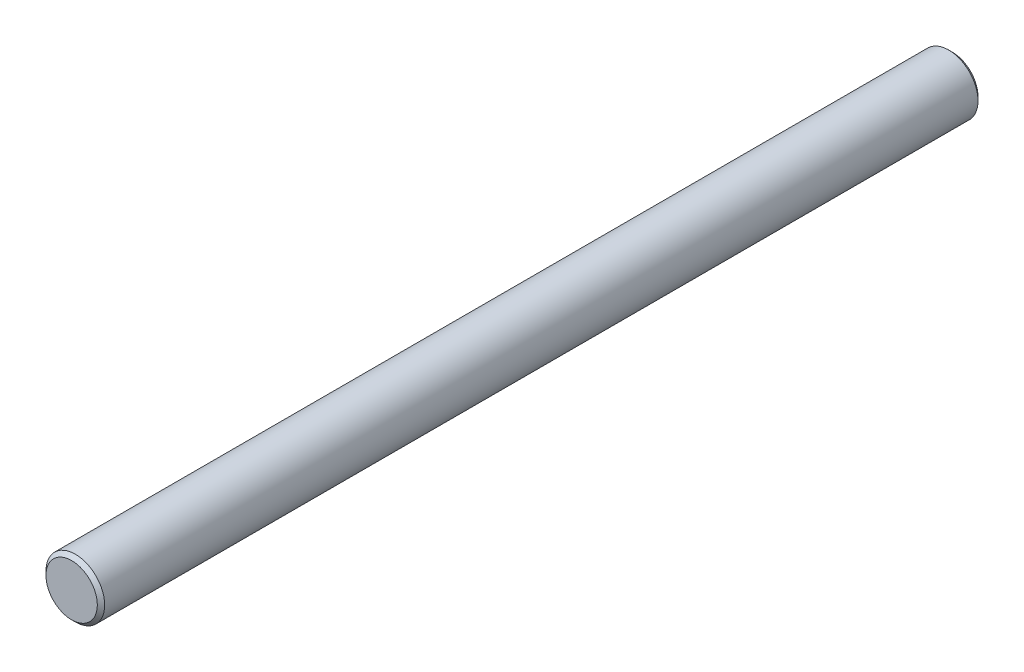
ISO-10303-21;
HEADER;
FILE_DESCRIPTION(('STEP AP214'),'2;1');
FILE_NAME('part.step','',(''),(''),'','','');
FILE_SCHEMA(('AUTOMOTIVE_DESIGN { 1 0 10303 214 1 1 1 1 }'));
ENDSEC;
DATA;
#1=APPLICATION_CONTEXT('core data for automotive mechanical design processes');
#2=APPLICATION_PROTOCOL_DEFINITION('international standard','automotive_design',2000,#1);
#3=PRODUCT_CONTEXT('',#1,'mechanical');
#4=PRODUCT('Part','Part','',(#3));
#5=PRODUCT_RELATED_PRODUCT_CATEGORY('part','',(#4));
#6=PRODUCT_DEFINITION_FORMATION('','',#4);
#7=PRODUCT_DEFINITION_CONTEXT('part definition',#1,'design');
#8=PRODUCT_DEFINITION('design','',#6,#7);
#9=PRODUCT_DEFINITION_SHAPE('','',#8);
#10=(LENGTH_UNIT() NAMED_UNIT(*) SI_UNIT(.MILLI.,.METRE.));
#11=(NAMED_UNIT(*) PLANE_ANGLE_UNIT() SI_UNIT($,.RADIAN.));
#12=(NAMED_UNIT(*) SI_UNIT($,.STERADIAN.) SOLID_ANGLE_UNIT());
#13=UNCERTAINTY_MEASURE_WITH_UNIT(LENGTH_MEASURE(1.E-05),#10,'distance_accuracy_value','');
#14=(GEOMETRIC_REPRESENTATION_CONTEXT(3) GLOBAL_UNCERTAINTY_ASSIGNED_CONTEXT((#13)) GLOBAL_UNIT_ASSIGNED_CONTEXT((#10,
#11,#12)) REPRESENTATION_CONTEXT('',''));
#15=CARTESIAN_POINT('',(0.,0.,0.));
#16=DIRECTION('',(0.,0.,1.));
#17=DIRECTION('',(1.,0.,0.));
#18=AXIS2_PLACEMENT_3D('',#15,#16,#17);
#19=CARTESIAN_POINT('',(0.,0.,120.));
#20=DIRECTION('',(0.,0.,-1.));
#21=DIRECTION('',(-1.,0.,0.));
#22=AXIS2_PLACEMENT_3D('',#19,#20,#21);
#23=CYLINDRICAL_SURFACE('',#22,4.);
#24=CARTESIAN_POINT('',(0.,0.,0.499999999999987));
#25=DIRECTION('',(0.,0.,1.));
#26=DIRECTION('',(1.,0.,0.));
#27=AXIS2_PLACEMENT_3D('',#24,#25,#26);
#28=CIRCLE('',#27,4.);
#29=CARTESIAN_POINT('',(4.,0.,0.499999999999987));
#30=VERTEX_POINT('',#29);
#31=EDGE_CURVE('E42',#30,#30,#28,.T.);
#32=ORIENTED_EDGE('',*,*,#31,.T.);
#33=EDGE_LOOP('',(#32));
#34=FACE_BOUND('',#33,.T.);
#35=CARTESIAN_POINT('',(0.,0.,119.5));
#36=DIRECTION('',(0.,0.,1.));
#37=DIRECTION('',(1.,0.,0.));
#38=AXIS2_PLACEMENT_3D('',#35,#36,#37);
#39=CIRCLE('',#38,4.);
#40=CARTESIAN_POINT('',(4.,0.,119.5));
#41=VERTEX_POINT('',#40);
#42=EDGE_CURVE('E46',#41,#41,#39,.F.);
#43=ORIENTED_EDGE('',*,*,#42,.T.);
#44=EDGE_LOOP('',(#43));
#45=FACE_BOUND('',#44,.T.);
#46=ADVANCED_FACE('F31',(#34,#45),#23,.T.);
#47=CARTESIAN_POINT('',(0.,0.,120.));
#48=DIRECTION('',(0.,0.,1.));
#49=DIRECTION('',(1.,0.,0.));
#50=AXIS2_PLACEMENT_3D('',#47,#48,#49);
#51=PLANE('',#50);
#52=CARTESIAN_POINT('',(0.,0.,120.));
#53=DIRECTION('',(0.,0.,1.));
#54=DIRECTION('',(1.,0.,0.));
#55=AXIS2_PLACEMENT_3D('',#52,#53,#54);
#56=CIRCLE('',#55,3.50000000000002);
#57=CARTESIAN_POINT('',(3.50000000000002,0.,120.));
#58=VERTEX_POINT('',#57);
#59=EDGE_CURVE('E10',#58,#58,#56,.T.);
#60=ORIENTED_EDGE('',*,*,#59,.T.);
#61=EDGE_LOOP('',(#60));
#62=FACE_BOUND('',#61,.T.);
#63=ADVANCED_FACE('F62',(#62),#51,.T.);
#64=CARTESIAN_POINT('',(0.,0.,0.));
#65=DIRECTION('',(0.,0.,1.));
#66=DIRECTION('',(1.,0.,0.));
#67=AXIS2_PLACEMENT_3D('',#64,#65,#66);
#68=PLANE('',#67);
#69=CARTESIAN_POINT('',(0.,0.,0.));
#70=DIRECTION('',(0.,0.,1.));
#71=DIRECTION('',(1.,0.,0.));
#72=AXIS2_PLACEMENT_3D('',#69,#70,#71);
#73=CIRCLE('',#72,3.50000000000002);
#74=CARTESIAN_POINT('',(3.50000000000002,0.,0.));
#75=VERTEX_POINT('',#74);
#76=EDGE_CURVE('E38',#75,#75,#73,.F.);
#77=ORIENTED_EDGE('',*,*,#76,.T.);
#78=EDGE_LOOP('',(#77));
#79=FACE_BOUND('',#78,.T.);
#80=ADVANCED_FACE('F59',(#79),#68,.F.);
#81=CARTESIAN_POINT('',(0.,0.,0.499999999999987));
#82=DIRECTION('',(0.,0.,1.));
#83=DIRECTION('',(1.,0.,0.));
#84=AXIS2_PLACEMENT_3D('',#81,#82,#83);
#85=CONICAL_SURFACE('',#84,4.,0.785398163397445);
#86=ORIENTED_EDGE('',*,*,#76,.F.);
#87=EDGE_LOOP('',(#86));
#88=FACE_BOUND('',#87,.T.);
#89=ORIENTED_EDGE('',*,*,#31,.F.);
#90=EDGE_LOOP('',(#89));
#91=FACE_BOUND('',#90,.T.);
#92=ADVANCED_FACE('F55',(#88,#91),#85,.T.);
#93=CARTESIAN_POINT('',(0.,0.,120.));
#94=DIRECTION('',(0.,0.,-1.));
#95=DIRECTION('',(-1.,0.,0.));
#96=AXIS2_PLACEMENT_3D('',#93,#94,#95);
#97=CONICAL_SURFACE('',#96,3.50000000000002,0.785398163397445);
#98=ORIENTED_EDGE('',*,*,#42,.F.);
#99=EDGE_LOOP('',(#98));
#100=FACE_BOUND('',#99,.T.);
#101=ORIENTED_EDGE('',*,*,#59,.F.);
#102=EDGE_LOOP('',(#101));
#103=FACE_BOUND('',#102,.T.);
#104=ADVANCED_FACE('F33',(#100,#103),#97,.T.);
#105=CLOSED_SHELL('',(#46,#63,#80,#92,#104));
#106=MANIFOLD_SOLID_BREP('B2',#105);
#107=ADVANCED_BREP_SHAPE_REPRESENTATION('',(#18,#106),#14);
#108=SHAPE_DEFINITION_REPRESENTATION(#9,#107);
ENDSEC;
END-ISO-10303-21;
